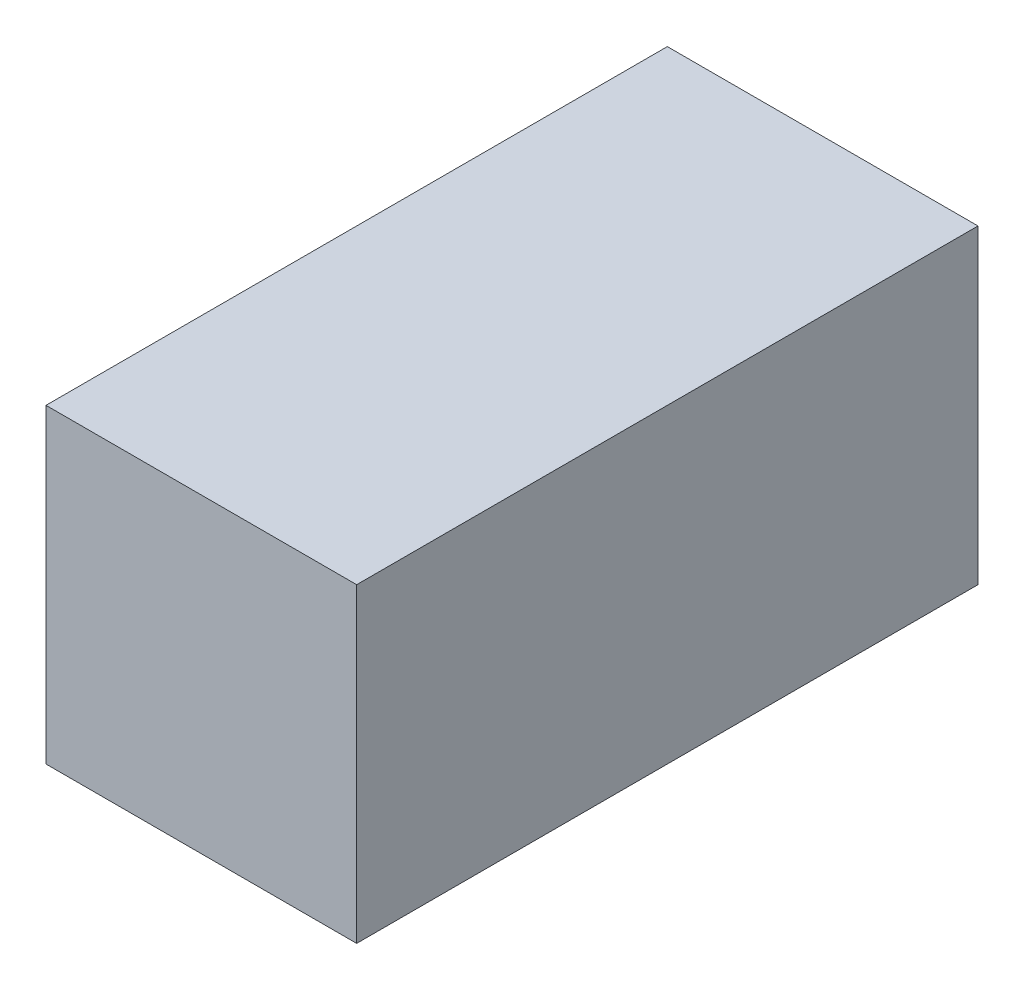
ISO-10303-21;
HEADER;
FILE_DESCRIPTION(('STEP AP214'),'2;1');
FILE_NAME('part.step','',(''),(''),'','','');
FILE_SCHEMA(('AUTOMOTIVE_DESIGN { 1 0 10303 214 1 1 1 1 }'));
ENDSEC;
DATA;
#1=APPLICATION_CONTEXT('core data for automotive mechanical design processes');
#2=APPLICATION_PROTOCOL_DEFINITION('international standard','automotive_design',2000,#1);
#3=PRODUCT_CONTEXT('',#1,'mechanical');
#4=PRODUCT('Part','Part','',(#3));
#5=PRODUCT_RELATED_PRODUCT_CATEGORY('part','',(#4));
#6=PRODUCT_DEFINITION_FORMATION('','',#4);
#7=PRODUCT_DEFINITION_CONTEXT('part definition',#1,'design');
#8=PRODUCT_DEFINITION('design','',#6,#7);
#9=PRODUCT_DEFINITION_SHAPE('','',#8);
#10=(LENGTH_UNIT() NAMED_UNIT(*) SI_UNIT(.MILLI.,.METRE.));
#11=(NAMED_UNIT(*) PLANE_ANGLE_UNIT() SI_UNIT($,.RADIAN.));
#12=(NAMED_UNIT(*) SI_UNIT($,.STERADIAN.) SOLID_ANGLE_UNIT());
#13=UNCERTAINTY_MEASURE_WITH_UNIT(LENGTH_MEASURE(1.E-05),#10,'distance_accuracy_value','');
#14=(GEOMETRIC_REPRESENTATION_CONTEXT(3) GLOBAL_UNCERTAINTY_ASSIGNED_CONTEXT((#13)) GLOBAL_UNIT_ASSIGNED_CONTEXT((#10,
#11,#12)) REPRESENTATION_CONTEXT('',''));
#15=CARTESIAN_POINT('',(0.,0.,0.));
#16=DIRECTION('',(0.,0.,1.));
#17=DIRECTION('',(1.,0.,0.));
#18=AXIS2_PLACEMENT_3D('',#15,#16,#17);
#19=CARTESIAN_POINT('',(10.,0.,0.));
#20=DIRECTION('',(0.,0.,-1.));
#21=DIRECTION('',(-1.,0.,0.));
#22=AXIS2_PLACEMENT_3D('',#19,#20,#21);
#23=PLANE('',#22);
#24=DIRECTION('',(0.,-1.,0.));
#25=VECTOR('',#24,1.);
#26=CARTESIAN_POINT('',(0.,0.,0.));
#27=LINE('',#26,#25);
#28=CARTESIAN_POINT('',(0.,10.,0.));
#29=VERTEX_POINT('',#28);
#30=CARTESIAN_POINT('',(0.,0.,0.));
#31=VERTEX_POINT('',#30);
#32=EDGE_CURVE('E96',#29,#31,#27,.T.);
#33=ORIENTED_EDGE('',*,*,#32,.T.);
#34=DIRECTION('',(-1.,0.,0.));
#35=VECTOR('',#34,1.);
#36=CARTESIAN_POINT('',(10.,0.,0.));
#37=LINE('',#36,#35);
#38=CARTESIAN_POINT('',(10.,0.,0.));
#39=VERTEX_POINT('',#38);
#40=EDGE_CURVE('E11',#39,#31,#37,.T.);
#41=ORIENTED_EDGE('',*,*,#40,.F.);
#42=DIRECTION('',(0.,-1.,0.));
#43=VECTOR('',#42,1.);
#44=CARTESIAN_POINT('',(10.,0.,0.));
#45=LINE('',#44,#43);
#46=CARTESIAN_POINT('',(10.,10.,0.));
#47=VERTEX_POINT('',#46);
#48=EDGE_CURVE('E84',#47,#39,#45,.T.);
#49=ORIENTED_EDGE('',*,*,#48,.F.);
#50=DIRECTION('',(-1.,0.,0.));
#51=VECTOR('',#50,1.);
#52=CARTESIAN_POINT('',(10.,10.,0.));
#53=LINE('',#52,#51);
#54=EDGE_CURVE('E92',#47,#29,#53,.T.);
#55=ORIENTED_EDGE('',*,*,#54,.T.);
#56=EDGE_LOOP('',(#33,#41,#49,#55));
#57=FACE_BOUND('',#56,.T.);
#58=ADVANCED_FACE('F33',(#57),#23,.F.);
#59=CARTESIAN_POINT('',(10.,0.,0.));
#60=DIRECTION('',(0.,1.,0.));
#61=DIRECTION('',(0.,0.,1.));
#62=AXIS2_PLACEMENT_3D('',#59,#60,#61);
#63=PLANE('',#62);
#64=DIRECTION('',(0.,0.,-1.));
#65=VECTOR('',#64,1.);
#66=CARTESIAN_POINT('',(0.,0.,0.));
#67=LINE('',#66,#65);
#68=CARTESIAN_POINT('',(0.,0.,-20.));
#69=VERTEX_POINT('',#68);
#70=EDGE_CURVE('E88',#31,#69,#67,.T.);
#71=ORIENTED_EDGE('',*,*,#70,.T.);
#72=DIRECTION('',(-1.,0.,0.));
#73=VECTOR('',#72,1.);
#74=CARTESIAN_POINT('',(10.,0.,-20.));
#75=LINE('',#74,#73);
#76=CARTESIAN_POINT('',(10.,0.,-20.));
#77=VERTEX_POINT('',#76);
#78=EDGE_CURVE('E41',#77,#69,#75,.T.);
#79=ORIENTED_EDGE('',*,*,#78,.F.);
#80=DIRECTION('',(0.,0.,-1.));
#81=VECTOR('',#80,1.);
#82=CARTESIAN_POINT('',(10.,0.,0.));
#83=LINE('',#82,#81);
#84=EDGE_CURVE('E79',#39,#77,#83,.T.);
#85=ORIENTED_EDGE('',*,*,#84,.F.);
#86=ORIENTED_EDGE('',*,*,#40,.T.);
#87=EDGE_LOOP('',(#71,#79,#85,#86));
#88=FACE_BOUND('',#87,.T.);
#89=ADVANCED_FACE('F87',(#88),#63,.F.);
#90=CARTESIAN_POINT('',(10.,0.,-20.));
#91=DIRECTION('',(0.,0.,1.));
#92=DIRECTION('',(1.,0.,0.));
#93=AXIS2_PLACEMENT_3D('',#90,#91,#92);
#94=PLANE('',#93);
#95=DIRECTION('',(0.,1.,0.));
#96=VECTOR('',#95,1.);
#97=CARTESIAN_POINT('',(0.,0.,-20.));
#98=LINE('',#97,#96);
#99=CARTESIAN_POINT('',(0.,10.,-20.));
#100=VERTEX_POINT('',#99);
#101=EDGE_CURVE('E66',#69,#100,#98,.T.);
#102=ORIENTED_EDGE('',*,*,#101,.T.);
#103=DIRECTION('',(-1.,0.,0.));
#104=VECTOR('',#103,1.);
#105=CARTESIAN_POINT('',(10.,10.,-20.));
#106=LINE('',#105,#104);
#107=CARTESIAN_POINT('',(10.,10.,-20.));
#108=VERTEX_POINT('',#107);
#109=EDGE_CURVE('E89',#108,#100,#106,.T.);
#110=ORIENTED_EDGE('',*,*,#109,.F.);
#111=DIRECTION('',(0.,1.,0.));
#112=VECTOR('',#111,1.);
#113=CARTESIAN_POINT('',(10.,0.,-20.));
#114=LINE('',#113,#112);
#115=EDGE_CURVE('E82',#77,#108,#114,.T.);
#116=ORIENTED_EDGE('',*,*,#115,.F.);
#117=ORIENTED_EDGE('',*,*,#78,.T.);
#118=EDGE_LOOP('',(#102,#110,#116,#117));
#119=FACE_BOUND('',#118,.T.);
#120=ADVANCED_FACE('F90',(#119),#94,.F.);
#121=CARTESIAN_POINT('',(10.,10.,0.));
#122=DIRECTION('',(0.,-1.,0.));
#123=DIRECTION('',(0.,0.,-1.));
#124=AXIS2_PLACEMENT_3D('',#121,#122,#123);
#125=PLANE('',#124);
#126=DIRECTION('',(0.,0.,1.));
#127=VECTOR('',#126,1.);
#128=CARTESIAN_POINT('',(0.,10.,0.));
#129=LINE('',#128,#127);
#130=EDGE_CURVE('E72',#100,#29,#129,.T.);
#131=ORIENTED_EDGE('',*,*,#130,.T.);
#132=ORIENTED_EDGE('',*,*,#54,.F.);
#133=DIRECTION('',(0.,0.,1.));
#134=VECTOR('',#133,1.);
#135=CARTESIAN_POINT('',(10.,10.,0.));
#136=LINE('',#135,#134);
#137=EDGE_CURVE('E49',#108,#47,#136,.T.);
#138=ORIENTED_EDGE('',*,*,#137,.F.);
#139=ORIENTED_EDGE('',*,*,#109,.T.);
#140=EDGE_LOOP('',(#131,#132,#138,#139));
#141=FACE_BOUND('',#140,.T.);
#142=ADVANCED_FACE('F103',(#141),#125,.F.);
#143=CARTESIAN_POINT('',(10.,0.,0.));
#144=DIRECTION('',(-1.,0.,0.));
#145=DIRECTION('',(0.,0.,1.));
#146=AXIS2_PLACEMENT_3D('',#143,#144,#145);
#147=PLANE('',#146);
#148=ORIENTED_EDGE('',*,*,#48,.T.);
#149=ORIENTED_EDGE('',*,*,#84,.T.);
#150=ORIENTED_EDGE('',*,*,#115,.T.);
#151=ORIENTED_EDGE('',*,*,#137,.T.);
#152=EDGE_LOOP('',(#148,#149,#150,#151));
#153=FACE_BOUND('',#152,.T.);
#154=ADVANCED_FACE('F80',(#153),#147,.F.);
#155=CARTESIAN_POINT('',(0.,0.,0.));
#156=DIRECTION('',(-1.,0.,0.));
#157=DIRECTION('',(0.,0.,1.));
#158=AXIS2_PLACEMENT_3D('',#155,#156,#157);
#159=PLANE('',#158);
#160=ORIENTED_EDGE('',*,*,#32,.F.);
#161=ORIENTED_EDGE('',*,*,#130,.F.);
#162=ORIENTED_EDGE('',*,*,#101,.F.);
#163=ORIENTED_EDGE('',*,*,#70,.F.);
#164=EDGE_LOOP('',(#160,#161,#162,#163));
#165=FACE_BOUND('',#164,.T.);
#166=ADVANCED_FACE('F106',(#165),#159,.T.);
#167=CLOSED_SHELL('',(#58,#89,#120,#142,#154,#166));
#168=MANIFOLD_SOLID_BREP('B2',#167);
#169=ADVANCED_BREP_SHAPE_REPRESENTATION('',(#18,#168),#14);
#170=SHAPE_DEFINITION_REPRESENTATION(#9,#169);
ENDSEC;
END-ISO-10303-21;
